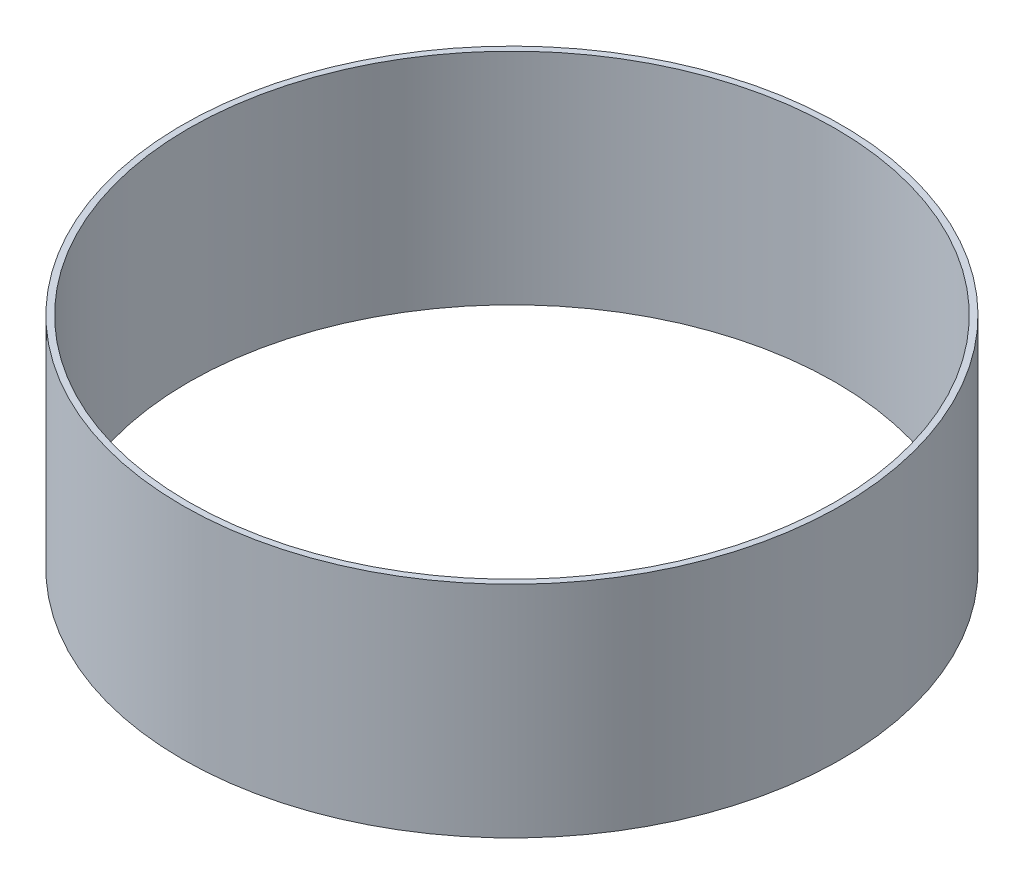
ISO-10303-21;
HEADER;
FILE_DESCRIPTION(('STEP AP214'),'2;1');
FILE_NAME('part.step','',(''),(''),'','','');
FILE_SCHEMA(('AUTOMOTIVE_DESIGN { 1 0 10303 214 1 1 1 1 }'));
ENDSEC;
DATA;
#1=APPLICATION_CONTEXT('core data for automotive mechanical design processes');
#2=APPLICATION_PROTOCOL_DEFINITION('international standard','automotive_design',2000,#1);
#3=PRODUCT_CONTEXT('',#1,'mechanical');
#4=PRODUCT('Part','Part','',(#3));
#5=PRODUCT_RELATED_PRODUCT_CATEGORY('part','',(#4));
#6=PRODUCT_DEFINITION_FORMATION('','',#4);
#7=PRODUCT_DEFINITION_CONTEXT('part definition',#1,'design');
#8=PRODUCT_DEFINITION('design','',#6,#7);
#9=PRODUCT_DEFINITION_SHAPE('','',#8);
#10=(LENGTH_UNIT() NAMED_UNIT(*) SI_UNIT(.MILLI.,.METRE.));
#11=(NAMED_UNIT(*) PLANE_ANGLE_UNIT() SI_UNIT($,.RADIAN.));
#12=(NAMED_UNIT(*) SI_UNIT($,.STERADIAN.) SOLID_ANGLE_UNIT());
#13=UNCERTAINTY_MEASURE_WITH_UNIT(LENGTH_MEASURE(1.E-05),#10,'distance_accuracy_value','');
#14=(GEOMETRIC_REPRESENTATION_CONTEXT(3) GLOBAL_UNCERTAINTY_ASSIGNED_CONTEXT((#13)) GLOBAL_UNIT_ASSIGNED_CONTEXT((#10,
#11,#12)) REPRESENTATION_CONTEXT('',''));
#15=CARTESIAN_POINT('',(0.,0.,0.));
#16=DIRECTION('',(0.,0.,1.));
#17=DIRECTION('',(1.,0.,0.));
#18=AXIS2_PLACEMENT_3D('',#15,#16,#17);
#19=CARTESIAN_POINT('',(0.,25.4,0.));
#20=DIRECTION('',(0.,1.,0.));
#21=DIRECTION('',(0.,0.,1.));
#22=AXIS2_PLACEMENT_3D('',#19,#20,#21);
#23=PLANE('',#22);
#24=CARTESIAN_POINT('',(0.,25.4,0.));
#25=DIRECTION('',(0.,1.,0.));
#26=DIRECTION('',(0.,0.,1.));
#27=AXIS2_PLACEMENT_3D('',#24,#25,#26);
#28=CIRCLE('',#27,76.2);
#29=CARTESIAN_POINT('',(0.,25.4,76.2));
#30=VERTEX_POINT('',#29);
#31=EDGE_CURVE('E10',#30,#30,#28,.T.);
#32=ORIENTED_EDGE('',*,*,#31,.T.);
#33=EDGE_LOOP('',(#32));
#34=FACE_BOUND('',#33,.T.);
#35=CARTESIAN_POINT('',(0.,25.4,0.));
#36=DIRECTION('',(0.,1.,0.));
#37=DIRECTION('',(0.,0.,1.));
#38=AXIS2_PLACEMENT_3D('',#35,#36,#37);
#39=CIRCLE('',#38,74.7776);
#40=CARTESIAN_POINT('',(0.,25.4,74.7776));
#41=VERTEX_POINT('',#40);
#42=EDGE_CURVE('E46',#41,#41,#39,.T.);
#43=ORIENTED_EDGE('',*,*,#42,.F.);
#44=EDGE_LOOP('',(#43));
#45=FACE_BOUND('',#44,.T.);
#46=ADVANCED_FACE('F35',(#34,#45),#23,.T.);
#47=CARTESIAN_POINT('',(0.,-25.4,0.));
#48=DIRECTION('',(0.,1.,0.));
#49=DIRECTION('',(0.,0.,1.));
#50=AXIS2_PLACEMENT_3D('',#47,#48,#49);
#51=PLANE('',#50);
#52=CARTESIAN_POINT('',(0.,-25.4,0.));
#53=DIRECTION('',(0.,1.,0.));
#54=DIRECTION('',(0.,0.,1.));
#55=AXIS2_PLACEMENT_3D('',#52,#53,#54);
#56=CIRCLE('',#55,76.2);
#57=CARTESIAN_POINT('',(0.,-25.4,76.2));
#58=VERTEX_POINT('',#57);
#59=EDGE_CURVE('E39',#58,#58,#56,.T.);
#60=ORIENTED_EDGE('',*,*,#59,.F.);
#61=EDGE_LOOP('',(#60));
#62=FACE_BOUND('',#61,.T.);
#63=CARTESIAN_POINT('',(0.,-25.4,0.));
#64=DIRECTION('',(0.,1.,0.));
#65=DIRECTION('',(0.,0.,1.));
#66=AXIS2_PLACEMENT_3D('',#63,#64,#65);
#67=CIRCLE('',#66,74.7776);
#68=CARTESIAN_POINT('',(0.,-25.4,74.7776));
#69=VERTEX_POINT('',#68);
#70=EDGE_CURVE('E48',#69,#69,#67,.T.);
#71=ORIENTED_EDGE('',*,*,#70,.T.);
#72=EDGE_LOOP('',(#71));
#73=FACE_BOUND('',#72,.T.);
#74=ADVANCED_FACE('F58',(#62,#73),#51,.F.);
#75=CARTESIAN_POINT('',(0.,25.4,0.));
#76=DIRECTION('',(0.,-1.,0.));
#77=DIRECTION('',(0.,0.,-1.));
#78=AXIS2_PLACEMENT_3D('',#75,#76,#77);
#79=CYLINDRICAL_SURFACE('',#78,76.2);
#80=ORIENTED_EDGE('',*,*,#31,.F.);
#81=EDGE_LOOP('',(#80));
#82=FACE_BOUND('',#81,.T.);
#83=ORIENTED_EDGE('',*,*,#59,.T.);
#84=EDGE_LOOP('',(#83));
#85=FACE_BOUND('',#84,.T.);
#86=ADVANCED_FACE('F37',(#82,#85),#79,.T.);
#87=CARTESIAN_POINT('',(0.,25.4,0.));
#88=DIRECTION('',(0.,-1.,0.));
#89=DIRECTION('',(0.,0.,-1.));
#90=AXIS2_PLACEMENT_3D('',#87,#88,#89);
#91=CYLINDRICAL_SURFACE('',#90,74.7776);
#92=ORIENTED_EDGE('',*,*,#42,.T.);
#93=EDGE_LOOP('',(#92));
#94=FACE_BOUND('',#93,.T.);
#95=ORIENTED_EDGE('',*,*,#70,.F.);
#96=EDGE_LOOP('',(#95));
#97=FACE_BOUND('',#96,.T.);
#98=ADVANCED_FACE('F54',(#94,#97),#91,.F.);
#99=CLOSED_SHELL('',(#46,#74,#86,#98));
#100=MANIFOLD_SOLID_BREP('B2',#99);
#101=ADVANCED_BREP_SHAPE_REPRESENTATION('',(#18,#100),#14);
#102=SHAPE_DEFINITION_REPRESENTATION(#9,#101);
ENDSEC;
END-ISO-10303-21;
